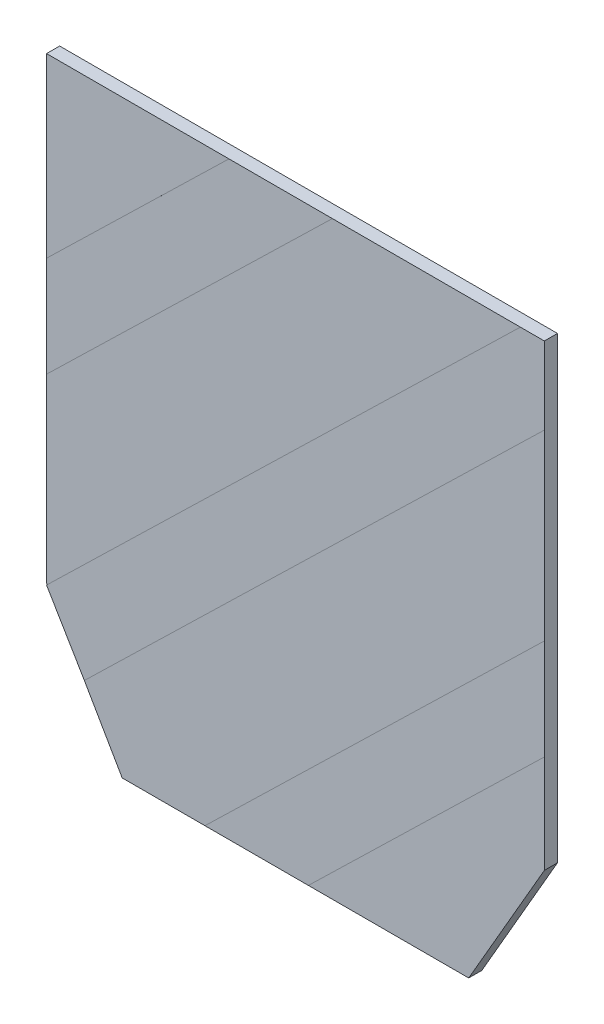
ISO-10303-21;
HEADER;
FILE_DESCRIPTION(('STEP AP214'),'2;1');
FILE_NAME('part.step','',(''),(''),'','','');
FILE_SCHEMA(('AUTOMOTIVE_DESIGN { 1 0 10303 214 1 1 1 1 }'));
ENDSEC;
DATA;
#1=APPLICATION_CONTEXT('core data for automotive mechanical design processes');
#2=APPLICATION_PROTOCOL_DEFINITION('international standard','automotive_design',2000,#1);
#3=PRODUCT_CONTEXT('',#1,'mechanical');
#4=PRODUCT('Part','Part','',(#3));
#5=PRODUCT_RELATED_PRODUCT_CATEGORY('part','',(#4));
#6=PRODUCT_DEFINITION_FORMATION('','',#4);
#7=PRODUCT_DEFINITION_CONTEXT('part definition',#1,'design');
#8=PRODUCT_DEFINITION('design','',#6,#7);
#9=PRODUCT_DEFINITION_SHAPE('','',#8);
#10=(LENGTH_UNIT() NAMED_UNIT(*) SI_UNIT(.MILLI.,.METRE.));
#11=(NAMED_UNIT(*) PLANE_ANGLE_UNIT() SI_UNIT($,.RADIAN.));
#12=(NAMED_UNIT(*) SI_UNIT($,.STERADIAN.) SOLID_ANGLE_UNIT());
#13=UNCERTAINTY_MEASURE_WITH_UNIT(LENGTH_MEASURE(1.E-05),#10,'distance_accuracy_value','');
#14=(GEOMETRIC_REPRESENTATION_CONTEXT(3) GLOBAL_UNCERTAINTY_ASSIGNED_CONTEXT((#13)) GLOBAL_UNIT_ASSIGNED_CONTEXT((#10,
#11,#12)) REPRESENTATION_CONTEXT('',''));
#15=CARTESIAN_POINT('',(0.,0.,0.));
#16=DIRECTION('',(0.,0.,1.));
#17=DIRECTION('',(1.,0.,0.));
#18=AXIS2_PLACEMENT_3D('',#15,#16,#17);
#19=CARTESIAN_POINT('',(0.,0.,2.));
#20=DIRECTION('',(0.,0.,-1.));
#21=DIRECTION('',(-1.,0.,0.));
#22=AXIS2_PLACEMENT_3D('',#19,#20,#21);
#23=PLANE('',#22);
#24=DIRECTION('',(0.717287947352775,0.696776865705544,0.));
#25=VECTOR('',#24,1.);
#26=CARTESIAN_POINT('',(1.96970193330662,-55.,2.));
#27=LINE('',#26,#25);
#28=CARTESIAN_POINT('',(1.96970193330662,-55.,2.));
#29=VERTEX_POINT('',#28);
#30=CARTESIAN_POINT('',(38.,-20.,2.));
#31=VERTEX_POINT('',#30);
#32=EDGE_CURVE('E350',#29,#31,#27,.T.);
#33=ORIENTED_EDGE('',*,*,#32,.F.);
#34=DIRECTION('',(1.,0.,0.));
#35=VECTOR('',#34,1.);
#36=CARTESIAN_POINT('',(-26.4529946162075,-55.,2.));
#37=LINE('',#36,#35);
#38=CARTESIAN_POINT('',(26.4529946162075,-55.,2.));
#39=VERTEX_POINT('',#38);
#40=EDGE_CURVE('E190',#29,#39,#37,.T.);
#41=ORIENTED_EDGE('',*,*,#40,.T.);
#42=DIRECTION('',(0.499999999999998,0.86602540378444,0.));
#43=VECTOR('',#42,1.);
#44=CARTESIAN_POINT('',(26.4529946162075,-55.,2.));
#45=LINE('',#44,#43);
#46=CARTESIAN_POINT('',(38.,-35.,2.));
#47=VERTEX_POINT('',#46);
#48=EDGE_CURVE('E303',#39,#47,#45,.T.);
#49=ORIENTED_EDGE('',*,*,#48,.T.);
#50=DIRECTION('',(0.,1.,0.));
#51=VECTOR('',#50,1.);
#52=CARTESIAN_POINT('',(38.,-35.,2.));
#53=LINE('',#52,#51);
#54=EDGE_CURVE('E62',#47,#31,#53,.T.);
#55=ORIENTED_EDGE('',*,*,#54,.T.);
#56=EDGE_LOOP('',(#33,#41,#49,#55));
#57=FACE_BOUND('',#56,.T.);
#58=ADVANCED_FACE('F36',(#57),#23,.F.);
#59=DIRECTION('',(-0.717287947352775,-0.696776865705544,0.));
#60=VECTOR('',#59,1.);
#61=CARTESIAN_POINT('',(-13.8172745600383,-55.,2.));
#62=LINE('',#61,#60);
#63=CARTESIAN_POINT('',(38.,-4.66445722307668,2.));
#64=VERTEX_POINT('',#63);
#65=CARTESIAN_POINT('',(-13.8172745600383,-55.,2.));
#66=VERTEX_POINT('',#65);
#67=EDGE_CURVE('E54',#64,#66,#62,.T.);
#68=ORIENTED_EDGE('',*,*,#67,.F.);
#69=CARTESIAN_POINT('',(38.,23.2183478258748,2.));
#70=VERTEX_POINT('',#69);
#71=EDGE_CURVE('E288',#64,#70,#53,.T.);
#72=ORIENTED_EDGE('',*,*,#71,.T.);
#73=DIRECTION('',(0.717287947352775,0.696776865705544,0.));
#74=VECTOR('',#73,1.);
#75=CARTESIAN_POINT('',(-32.2264973081038,-45.,2.));
#76=LINE('',#75,#74);
#77=CARTESIAN_POINT('',(-32.2264973081038,-45.,2.));
#78=VERTEX_POINT('',#77);
#79=EDGE_CURVE('E194',#78,#70,#76,.T.);
#80=ORIENTED_EDGE('',*,*,#79,.F.);
#81=DIRECTION('',(0.499999999999998,-0.86602540378444,0.));
#82=VECTOR('',#81,1.);
#83=CARTESIAN_POINT('',(-38.,-35.,2.));
#84=LINE('',#83,#82);
#85=CARTESIAN_POINT('',(-26.4529946162075,-55.,2.));
#86=VERTEX_POINT('',#85);
#87=EDGE_CURVE('E300',#78,#86,#84,.T.);
#88=ORIENTED_EDGE('',*,*,#87,.T.);
#89=EDGE_CURVE('E301',#86,#66,#37,.T.);
#90=ORIENTED_EDGE('',*,*,#89,.T.);
#91=EDGE_LOOP('',(#68,#72,#80,#88,#90));
#92=FACE_BOUND('',#91,.T.);
#93=ADVANCED_FACE('F344',(#92),#23,.F.);
#94=DIRECTION('',(-0.717287947352775,-0.696776865705545,0.));
#95=VECTOR('',#94,1.);
#96=CARTESIAN_POINT('',(-38.,-35.272864731733,2.));
#97=LINE('',#96,#95);
#98=CARTESIAN_POINT('',(34.3414932081361,35.,2.));
#99=VERTEX_POINT('',#98);
#100=CARTESIAN_POINT('',(-37.8990681616744,-35.1748190720813,2.));
#101=VERTEX_POINT('',#100);
#102=EDGE_CURVE('E204',#99,#101,#97,.T.);
#103=ORIENTED_EDGE('',*,*,#102,.F.);
#104=DIRECTION('',(-1.,0.,0.));
#105=VECTOR('',#104,1.);
#106=CARTESIAN_POINT('',(-38.,35.,2.));
#107=LINE('',#106,#105);
#108=CARTESIAN_POINT('',(5.63789958387258,35.,2.));
#109=VERTEX_POINT('',#108);
#110=EDGE_CURVE('E40',#99,#109,#107,.T.);
#111=ORIENTED_EDGE('',*,*,#110,.T.);
#112=DIRECTION('',(0.717287947352775,0.696776865705544,0.));
#113=VECTOR('',#112,1.);
#114=CARTESIAN_POINT('',(-38.,-7.39005968278155,2.));
#115=LINE('',#114,#113);
#116=CARTESIAN_POINT('',(-38.,-7.39005968278154,2.));
#117=VERTEX_POINT('',#116);
#118=EDGE_CURVE('E230',#117,#109,#115,.T.);
#119=ORIENTED_EDGE('',*,*,#118,.F.);
#120=DIRECTION('',(0.,-1.,0.));
#121=VECTOR('',#120,1.);
#122=CARTESIAN_POINT('',(-38.,-35.,2.));
#123=LINE('',#122,#121);
#124=CARTESIAN_POINT('',(-38.,-35.,2.));
#125=VERTEX_POINT('',#124);
#126=EDGE_CURVE('E250',#117,#125,#123,.T.);
#127=ORIENTED_EDGE('',*,*,#126,.T.);
#128=EDGE_CURVE('E295',#125,#101,#84,.T.);
#129=ORIENTED_EDGE('',*,*,#128,.T.);
#130=EDGE_LOOP('',(#103,#111,#119,#127,#129));
#131=FACE_BOUND('',#130,.T.);
#132=ADVANCED_FACE('F373',(#131),#23,.F.);
#133=DIRECTION('',(-0.717287947352775,-0.696776865705544,0.));
#134=VECTOR('',#133,1.);
#135=CARTESIAN_POINT('',(-38.,7.94548309414176,2.));
#136=LINE('',#135,#134);
#137=CARTESIAN_POINT('',(-10.1490769094724,35.,2.));
#138=VERTEX_POINT('',#137);
#139=CARTESIAN_POINT('',(-38.,7.94548309414177,2.));
#140=VERTEX_POINT('',#139);
#141=EDGE_CURVE('E235',#138,#140,#136,.T.);
#142=ORIENTED_EDGE('',*,*,#141,.F.);
#143=CARTESIAN_POINT('',(-38.,35.,2.));
#144=VERTEX_POINT('',#143);
#145=EDGE_CURVE('E283',#138,#144,#107,.T.);
#146=ORIENTED_EDGE('',*,*,#145,.T.);
#147=EDGE_CURVE('E290',#144,#140,#123,.T.);
#148=ORIENTED_EDGE('',*,*,#147,.T.);
#149=EDGE_LOOP('',(#142,#146,#148));
#150=FACE_BOUND('',#149,.T.);
#151=ADVANCED_FACE('F392',(#150),#23,.F.);
#152=CARTESIAN_POINT('',(38.,-35.,2.));
#153=DIRECTION('',(-1.,0.,0.));
#154=DIRECTION('',(0.,0.,1.));
#155=AXIS2_PLACEMENT_3D('',#152,#153,#154);
#156=PLANE('',#155);
#157=DIRECTION('',(0.,1.,0.));
#158=VECTOR('',#157,1.);
#159=CARTESIAN_POINT('',(38.,-35.,0.));
#160=LINE('',#159,#158);
#161=CARTESIAN_POINT('',(38.,-35.,0.));
#162=VERTEX_POINT('',#161);
#163=CARTESIAN_POINT('',(38.,35.,0.));
#164=VERTEX_POINT('',#163);
#165=EDGE_CURVE('E262',#162,#164,#160,.T.);
#166=ORIENTED_EDGE('',*,*,#165,.T.);
#167=DIRECTION('',(0.,0.,-1.));
#168=VECTOR('',#167,1.);
#169=CARTESIAN_POINT('',(38.,35.,2.));
#170=LINE('',#169,#168);
#171=CARTESIAN_POINT('',(38.,35.,2.0001));
#172=VERTEX_POINT('',#171);
#173=EDGE_CURVE('E11',#172,#164,#170,.T.);
#174=ORIENTED_EDGE('',*,*,#173,.F.);
#175=DIRECTION('',(0.,1.,0.));
#176=VECTOR('',#175,1.);
#177=CARTESIAN_POINT('',(38.,35.,2.0001));
#178=LINE('',#177,#176);
#179=CARTESIAN_POINT('',(38.,23.2183478258748,2.0001));
#180=VERTEX_POINT('',#179);
#181=EDGE_CURVE('E206',#180,#172,#178,.T.);
#182=ORIENTED_EDGE('',*,*,#181,.F.);
#183=DIRECTION('',(0.,0.,-1.));
#184=VECTOR('',#183,1.);
#185=CARTESIAN_POINT('',(38.,23.2183478258748,2.0001));
#186=LINE('',#185,#184);
#187=EDGE_CURVE('E224',#180,#70,#186,.T.);
#188=ORIENTED_EDGE('',*,*,#187,.T.);
#189=ORIENTED_EDGE('',*,*,#71,.F.);
#190=DIRECTION('',(0.,0.,-1.));
#191=VECTOR('',#190,1.);
#192=CARTESIAN_POINT('',(38.,-4.66445722307668,2.0001));
#193=LINE('',#192,#191);
#194=CARTESIAN_POINT('',(38.,-4.66445722307668,2.0001));
#195=VERTEX_POINT('',#194);
#196=EDGE_CURVE('E196',#195,#64,#193,.T.);
#197=ORIENTED_EDGE('',*,*,#196,.F.);
#198=DIRECTION('',(0.,1.,0.));
#199=VECTOR('',#198,1.);
#200=CARTESIAN_POINT('',(38.,-4.66445722307668,2.0001));
#201=LINE('',#200,#199);
#202=CARTESIAN_POINT('',(38.,-20.,2.0001));
#203=VERTEX_POINT('',#202);
#204=EDGE_CURVE('E177',#203,#195,#201,.T.);
#205=ORIENTED_EDGE('',*,*,#204,.F.);
#206=DIRECTION('',(0.,0.,-1.));
#207=VECTOR('',#206,1.);
#208=CARTESIAN_POINT('',(38.,-20.,2.0001));
#209=LINE('',#208,#207);
#210=EDGE_CURVE('E174',#203,#31,#209,.T.);
#211=ORIENTED_EDGE('',*,*,#210,.T.);
#212=ORIENTED_EDGE('',*,*,#54,.F.);
#213=DIRECTION('',(0.,0.,-1.));
#214=VECTOR('',#213,1.);
#215=CARTESIAN_POINT('',(38.,-35.,2.));
#216=LINE('',#215,#214);
#217=EDGE_CURVE('E305',#47,#162,#216,.T.);
#218=ORIENTED_EDGE('',*,*,#217,.T.);
#219=EDGE_LOOP('',(#166,#174,#182,#188,#189,#197,#205,#211,#212,#218));
#220=FACE_BOUND('',#219,.T.);
#221=ADVANCED_FACE('F38',(#220),#156,.F.);
#222=CARTESIAN_POINT('',(-38.,35.,2.));
#223=DIRECTION('',(0.,-1.,0.));
#224=DIRECTION('',(0.,0.,-1.));
#225=AXIS2_PLACEMENT_3D('',#222,#223,#224);
#226=PLANE('',#225);
#227=DIRECTION('',(-1.,0.,0.));
#228=VECTOR('',#227,1.);
#229=CARTESIAN_POINT('',(-38.,35.,0.));
#230=LINE('',#229,#228);
#231=CARTESIAN_POINT('',(-38.,35.,0.));
#232=VERTEX_POINT('',#231);
#233=EDGE_CURVE('E308',#164,#232,#230,.T.);
#234=ORIENTED_EDGE('',*,*,#233,.T.);
#235=DIRECTION('',(0.,0.,-1.));
#236=VECTOR('',#235,1.);
#237=CARTESIAN_POINT('',(-38.,35.,2.));
#238=LINE('',#237,#236);
#239=EDGE_CURVE('E46',#144,#232,#238,.T.);
#240=ORIENTED_EDGE('',*,*,#239,.F.);
#241=ORIENTED_EDGE('',*,*,#145,.F.);
#242=DIRECTION('',(0.,0.,-1.));
#243=VECTOR('',#242,1.);
#244=CARTESIAN_POINT('',(-10.1490769094724,35.,2.0001));
#245=LINE('',#244,#243);
#246=CARTESIAN_POINT('',(-10.1490769094724,35.,2.0001));
#247=VERTEX_POINT('',#246);
#248=EDGE_CURVE('E257',#247,#138,#245,.T.);
#249=ORIENTED_EDGE('',*,*,#248,.F.);
#250=DIRECTION('',(-1.,0.,0.));
#251=VECTOR('',#250,1.);
#252=CARTESIAN_POINT('',(-10.1490769094724,35.,2.0001));
#253=LINE('',#252,#251);
#254=CARTESIAN_POINT('',(5.63789958387258,35.,2.0001));
#255=VERTEX_POINT('',#254);
#256=EDGE_CURVE('E237',#255,#247,#253,.T.);
#257=ORIENTED_EDGE('',*,*,#256,.F.);
#258=DIRECTION('',(0.,0.,-1.));
#259=VECTOR('',#258,1.);
#260=CARTESIAN_POINT('',(5.63789958387258,35.,2.0001));
#261=LINE('',#260,#259);
#262=EDGE_CURVE('E253',#255,#109,#261,.T.);
#263=ORIENTED_EDGE('',*,*,#262,.T.);
#264=ORIENTED_EDGE('',*,*,#110,.F.);
#265=DIRECTION('',(0.,0.,-1.));
#266=VECTOR('',#265,1.);
#267=CARTESIAN_POINT('',(34.3414932081361,35.,2.0001));
#268=LINE('',#267,#266);
#269=CARTESIAN_POINT('',(34.3414932081361,35.,2.0001));
#270=VERTEX_POINT('',#269);
#271=EDGE_CURVE('E221',#270,#99,#268,.T.);
#272=ORIENTED_EDGE('',*,*,#271,.F.);
#273=DIRECTION('',(-1.,0.,0.));
#274=VECTOR('',#273,1.);
#275=CARTESIAN_POINT('',(34.3414932081361,35.,2.0001));
#276=LINE('',#275,#274);
#277=EDGE_CURVE('E209',#172,#270,#276,.T.);
#278=ORIENTED_EDGE('',*,*,#277,.F.);
#279=ORIENTED_EDGE('',*,*,#173,.T.);
#280=EDGE_LOOP('',(#234,#240,#241,#249,#257,#263,#264,#272,#278,#279));
#281=FACE_BOUND('',#280,.T.);
#282=ADVANCED_FACE('F281',(#281),#226,.F.);
#283=CARTESIAN_POINT('',(-38.,-35.,2.));
#284=DIRECTION('',(1.,0.,0.));
#285=DIRECTION('',(0.,0.,-1.));
#286=AXIS2_PLACEMENT_3D('',#283,#284,#285);
#287=PLANE('',#286);
#288=DIRECTION('',(0.,-1.,0.));
#289=VECTOR('',#288,1.);
#290=CARTESIAN_POINT('',(-38.,-35.,0.));
#291=LINE('',#290,#289);
#292=CARTESIAN_POINT('',(-38.,-35.,0.));
#293=VERTEX_POINT('',#292);
#294=EDGE_CURVE('E310',#232,#293,#291,.T.);
#295=ORIENTED_EDGE('',*,*,#294,.T.);
#296=DIRECTION('',(0.,0.,-1.));
#297=VECTOR('',#296,1.);
#298=CARTESIAN_POINT('',(-38.,-35.,2.));
#299=LINE('',#298,#297);
#300=EDGE_CURVE('E326',#125,#293,#299,.T.);
#301=ORIENTED_EDGE('',*,*,#300,.F.);
#302=ORIENTED_EDGE('',*,*,#126,.F.);
#303=DIRECTION('',(0.,0.,-1.));
#304=VECTOR('',#303,1.);
#305=CARTESIAN_POINT('',(-38.,-7.39005968278155,2.0001));
#306=LINE('',#305,#304);
#307=CARTESIAN_POINT('',(-38.,-7.39005968278155,2.0001));
#308=VERTEX_POINT('',#307);
#309=EDGE_CURVE('E256',#308,#117,#306,.T.);
#310=ORIENTED_EDGE('',*,*,#309,.F.);
#311=DIRECTION('',(0.,-1.,0.));
#312=VECTOR('',#311,1.);
#313=CARTESIAN_POINT('',(-38.,7.94548309414176,2.0001));
#314=LINE('',#313,#312);
#315=CARTESIAN_POINT('',(-38.,7.94548309414176,2.0001));
#316=VERTEX_POINT('',#315);
#317=EDGE_CURVE('E231',#316,#308,#314,.T.);
#318=ORIENTED_EDGE('',*,*,#317,.F.);
#319=DIRECTION('',(0.,0.,-1.));
#320=VECTOR('',#319,1.);
#321=CARTESIAN_POINT('',(-38.,7.94548309414176,2.0001));
#322=LINE('',#321,#320);
#323=EDGE_CURVE('E241',#316,#140,#322,.T.);
#324=ORIENTED_EDGE('',*,*,#323,.T.);
#325=ORIENTED_EDGE('',*,*,#147,.F.);
#326=ORIENTED_EDGE('',*,*,#239,.T.);
#327=EDGE_LOOP('',(#295,#301,#302,#310,#318,#324,#325,#326));
#328=FACE_BOUND('',#327,.T.);
#329=ADVANCED_FACE('F330',(#328),#287,.F.);
#330=CARTESIAN_POINT('',(-38.,-35.,2.));
#331=DIRECTION('',(0.86602540378444,0.499999999999998,0.));
#332=DIRECTION('',(-0.499999999999998,0.86602540378444,0.));
#333=AXIS2_PLACEMENT_3D('',#330,#331,#332);
#334=PLANE('',#333);
#335=DIRECTION('',(0.499999999999998,-0.86602540378444,0.));
#336=VECTOR('',#335,1.);
#337=CARTESIAN_POINT('',(-38.,-35.,0.));
#338=LINE('',#337,#336);
#339=CARTESIAN_POINT('',(-26.4529946162075,-55.,0.));
#340=VERTEX_POINT('',#339);
#341=EDGE_CURVE('E312',#293,#340,#338,.T.);
#342=ORIENTED_EDGE('',*,*,#341,.T.);
#343=DIRECTION('',(0.,0.,-1.));
#344=VECTOR('',#343,1.);
#345=CARTESIAN_POINT('',(-26.4529946162075,-55.,2.));
#346=LINE('',#345,#344);
#347=EDGE_CURVE('E323',#86,#340,#346,.T.);
#348=ORIENTED_EDGE('',*,*,#347,.F.);
#349=ORIENTED_EDGE('',*,*,#87,.F.);
#350=EDGE_CURVE('E299',#101,#78,#84,.T.);
#351=ORIENTED_EDGE('',*,*,#350,.F.);
#352=ORIENTED_EDGE('',*,*,#128,.F.);
#353=ORIENTED_EDGE('',*,*,#300,.T.);
#354=EDGE_LOOP('',(#342,#348,#349,#351,#352,#353));
#355=FACE_BOUND('',#354,.T.);
#356=ADVANCED_FACE('F340',(#355),#334,.F.);
#357=CARTESIAN_POINT('',(-26.4529946162075,-55.,2.));
#358=DIRECTION('',(0.,1.,0.));
#359=DIRECTION('',(0.,0.,1.));
#360=AXIS2_PLACEMENT_3D('',#357,#358,#359);
#361=PLANE('',#360);
#362=DIRECTION('',(1.,0.,0.));
#363=VECTOR('',#362,1.);
#364=CARTESIAN_POINT('',(-26.4529946162075,-55.,0.));
#365=LINE('',#364,#363);
#366=CARTESIAN_POINT('',(26.4529946162075,-55.,0.));
#367=VERTEX_POINT('',#366);
#368=EDGE_CURVE('E314',#340,#367,#365,.T.);
#369=ORIENTED_EDGE('',*,*,#368,.T.);
#370=DIRECTION('',(0.,0.,-1.));
#371=VECTOR('',#370,1.);
#372=CARTESIAN_POINT('',(26.4529946162075,-55.,2.));
#373=LINE('',#372,#371);
#374=EDGE_CURVE('E320',#39,#367,#373,.T.);
#375=ORIENTED_EDGE('',*,*,#374,.F.);
#376=ORIENTED_EDGE('',*,*,#40,.F.);
#377=DIRECTION('',(0.,0.,-1.));
#378=VECTOR('',#377,1.);
#379=CARTESIAN_POINT('',(1.96970193330662,-55.,2.0001));
#380=LINE('',#379,#378);
#381=CARTESIAN_POINT('',(1.96970193330662,-55.,2.0001));
#382=VERTEX_POINT('',#381);
#383=EDGE_CURVE('E172',#382,#29,#380,.T.);
#384=ORIENTED_EDGE('',*,*,#383,.F.);
#385=DIRECTION('',(1.,0.,0.));
#386=VECTOR('',#385,1.);
#387=CARTESIAN_POINT('',(-13.8172745600383,-55.,2.0001));
#388=LINE('',#387,#386);
#389=CARTESIAN_POINT('',(-13.8172745600383,-55.,2.0001));
#390=VERTEX_POINT('',#389);
#391=EDGE_CURVE('E178',#390,#382,#388,.T.);
#392=ORIENTED_EDGE('',*,*,#391,.F.);
#393=DIRECTION('',(0.,0.,-1.));
#394=VECTOR('',#393,1.);
#395=CARTESIAN_POINT('',(-13.8172745600383,-55.,2.0001));
#396=LINE('',#395,#394);
#397=EDGE_CURVE('E343',#390,#66,#396,.T.);
#398=ORIENTED_EDGE('',*,*,#397,.T.);
#399=ORIENTED_EDGE('',*,*,#89,.F.);
#400=ORIENTED_EDGE('',*,*,#347,.T.);
#401=EDGE_LOOP('',(#369,#375,#376,#384,#392,#398,#399,#400));
#402=FACE_BOUND('',#401,.T.);
#403=ADVANCED_FACE('F188',(#402),#361,.F.);
#404=CARTESIAN_POINT('',(26.4529946162075,-55.,2.));
#405=DIRECTION('',(-0.86602540378444,0.499999999999998,0.));
#406=DIRECTION('',(-0.499999999999998,-0.86602540378444,0.));
#407=AXIS2_PLACEMENT_3D('',#404,#405,#406);
#408=PLANE('',#407);
#409=DIRECTION('',(0.499999999999998,0.86602540378444,0.));
#410=VECTOR('',#409,1.);
#411=CARTESIAN_POINT('',(26.4529946162075,-55.,0.));
#412=LINE('',#411,#410);
#413=EDGE_CURVE('E316',#367,#162,#412,.T.);
#414=ORIENTED_EDGE('',*,*,#413,.T.);
#415=ORIENTED_EDGE('',*,*,#217,.F.);
#416=ORIENTED_EDGE('',*,*,#48,.F.);
#417=ORIENTED_EDGE('',*,*,#374,.T.);
#418=EDGE_LOOP('',(#414,#415,#416,#417));
#419=FACE_BOUND('',#418,.T.);
#420=ADVANCED_FACE('F423',(#419),#408,.F.);
#421=CARTESIAN_POINT('',(0.,0.,0.));
#422=DIRECTION('',(0.,0.,-1.));
#423=DIRECTION('',(-1.,0.,0.));
#424=AXIS2_PLACEMENT_3D('',#421,#422,#423);
#425=PLANE('',#424);
#426=ORIENTED_EDGE('',*,*,#165,.F.);
#427=ORIENTED_EDGE('',*,*,#413,.F.);
#428=ORIENTED_EDGE('',*,*,#368,.F.);
#429=ORIENTED_EDGE('',*,*,#341,.F.);
#430=ORIENTED_EDGE('',*,*,#294,.F.);
#431=ORIENTED_EDGE('',*,*,#233,.F.);
#432=EDGE_LOOP('',(#426,#427,#428,#429,#430,#431));
#433=FACE_BOUND('',#432,.T.);
#434=ADVANCED_FACE('F335',(#433),#425,.T.);
#435=CARTESIAN_POINT('',(-38.,-7.39005968278155,2.0001));
#436=DIRECTION('',(-0.696776865705544,0.717287947352775,0.));
#437=DIRECTION('',(-0.717287947352775,-0.696776865705544,0.));
#438=AXIS2_PLACEMENT_3D('',#435,#436,#437);
#439=PLANE('',#438);
#440=ORIENTED_EDGE('',*,*,#118,.T.);
#441=ORIENTED_EDGE('',*,*,#262,.F.);
#442=DIRECTION('',(0.717287947352775,0.696776865705544,0.));
#443=VECTOR('',#442,1.);
#444=CARTESIAN_POINT('',(-38.,-7.39005968278155,2.0001));
#445=LINE('',#444,#443);
#446=EDGE_CURVE('E234',#308,#255,#445,.T.);
#447=ORIENTED_EDGE('',*,*,#446,.F.);
#448=ORIENTED_EDGE('',*,*,#309,.T.);
#449=EDGE_LOOP('',(#440,#441,#447,#448));
#450=FACE_BOUND('',#449,.T.);
#451=ADVANCED_FACE('F377',(#450),#439,.F.);
#452=CARTESIAN_POINT('',(-38.,7.94548309414176,2.0001));
#453=DIRECTION('',(0.696776865705544,-0.717287947352775,0.));
#454=DIRECTION('',(0.717287947352775,0.696776865705544,0.));
#455=AXIS2_PLACEMENT_3D('',#452,#453,#454);
#456=PLANE('',#455);
#457=ORIENTED_EDGE('',*,*,#141,.T.);
#458=ORIENTED_EDGE('',*,*,#323,.F.);
#459=DIRECTION('',(-0.717287947352775,-0.696776865705544,0.));
#460=VECTOR('',#459,1.);
#461=CARTESIAN_POINT('',(-38.,7.94548309414176,2.0001));
#462=LINE('',#461,#460);
#463=EDGE_CURVE('E239',#247,#316,#462,.T.);
#464=ORIENTED_EDGE('',*,*,#463,.F.);
#465=ORIENTED_EDGE('',*,*,#248,.T.);
#466=EDGE_LOOP('',(#457,#458,#464,#465));
#467=FACE_BOUND('',#466,.T.);
#468=ADVANCED_FACE('F276',(#467),#456,.F.);
#469=CARTESIAN_POINT('',(0.,0.,2.0001));
#470=DIRECTION('',(0.,0.,1.));
#471=DIRECTION('',(1.,0.,0.));
#472=AXIS2_PLACEMENT_3D('',#469,#470,#471);
#473=PLANE('',#472);
#474=ORIENTED_EDGE('',*,*,#317,.T.);
#475=ORIENTED_EDGE('',*,*,#446,.T.);
#476=ORIENTED_EDGE('',*,*,#256,.T.);
#477=ORIENTED_EDGE('',*,*,#463,.T.);
#478=EDGE_LOOP('',(#474,#475,#476,#477));
#479=FACE_BOUND('',#478,.T.);
#480=ADVANCED_FACE('F380',(#479),#473,.T.);
#481=CARTESIAN_POINT('',(0.,0.,2.));
#482=DIRECTION('',(0.,0.,1.));
#483=DIRECTION('',(1.,0.,0.));
#484=AXIS2_PLACEMENT_3D('',#481,#482,#483);
#485=PLANE('',#484);
#486=CARTESIAN_POINT('',(-38.,-35.272864731733,2.));
#487=VERTEX_POINT('',#486);
#488=EDGE_CURVE('E216',#101,#487,#97,.T.);
#489=ORIENTED_EDGE('',*,*,#488,.F.);
#490=ORIENTED_EDGE('',*,*,#350,.T.);
#491=DIRECTION('',(0.510409077246612,-0.859931726280792,0.));
#492=VECTOR('',#491,1.);
#493=CARTESIAN_POINT('',(-38.,-35.272864731733,2.));
#494=LINE('',#493,#492);
#495=EDGE_CURVE('E191',#487,#78,#494,.T.);
#496=ORIENTED_EDGE('',*,*,#495,.F.);
#497=EDGE_LOOP('',(#489,#490,#496));
#498=FACE_BOUND('',#497,.T.);
#499=ADVANCED_FACE('F370',(#498),#485,.F.);
#500=CARTESIAN_POINT('',(-38.,-35.272864731733,2.0001));
#501=DIRECTION('',(0.859931726280792,0.510409077246612,0.));
#502=DIRECTION('',(-0.510409077246612,0.859931726280792,0.));
#503=AXIS2_PLACEMENT_3D('',#500,#501,#502);
#504=PLANE('',#503);
#505=ORIENTED_EDGE('',*,*,#495,.T.);
#506=DIRECTION('',(0.,0.,-1.));
#507=VECTOR('',#506,1.);
#508=CARTESIAN_POINT('',(-32.2264973081038,-45.,2.0001));
#509=LINE('',#508,#507);
#510=CARTESIAN_POINT('',(-32.2264973081038,-45.,2.0001));
#511=VERTEX_POINT('',#510);
#512=EDGE_CURVE('E227',#511,#78,#509,.T.);
#513=ORIENTED_EDGE('',*,*,#512,.F.);
#514=DIRECTION('',(0.510409077246612,-0.859931726280792,0.));
#515=VECTOR('',#514,1.);
#516=CARTESIAN_POINT('',(-38.,-35.272864731733,2.0001));
#517=LINE('',#516,#515);
#518=CARTESIAN_POINT('',(-38.,-35.272864731733,2.0001));
#519=VERTEX_POINT('',#518);
#520=EDGE_CURVE('E200',#519,#511,#517,.T.);
#521=ORIENTED_EDGE('',*,*,#520,.F.);
#522=DIRECTION('',(0.,0.,-1.));
#523=VECTOR('',#522,1.);
#524=CARTESIAN_POINT('',(-38.,-35.272864731733,2.0001));
#525=LINE('',#524,#523);
#526=EDGE_CURVE('E212',#519,#487,#525,.T.);
#527=ORIENTED_EDGE('',*,*,#526,.T.);
#528=EDGE_LOOP('',(#505,#513,#521,#527));
#529=FACE_BOUND('',#528,.T.);
#530=ADVANCED_FACE('F366',(#529),#504,.F.);
#531=CARTESIAN_POINT('',(-32.2264973081038,-45.,2.0001));
#532=DIRECTION('',(-0.696776865705544,0.717287947352775,0.));
#533=DIRECTION('',(-0.717287947352775,-0.696776865705544,0.));
#534=AXIS2_PLACEMENT_3D('',#531,#532,#533);
#535=PLANE('',#534);
#536=ORIENTED_EDGE('',*,*,#79,.T.);
#537=ORIENTED_EDGE('',*,*,#187,.F.);
#538=DIRECTION('',(0.717287947352775,0.696776865705544,0.));
#539=VECTOR('',#538,1.);
#540=CARTESIAN_POINT('',(-32.2264973081038,-45.,2.0001));
#541=LINE('',#540,#539);
#542=EDGE_CURVE('E203',#511,#180,#541,.T.);
#543=ORIENTED_EDGE('',*,*,#542,.F.);
#544=ORIENTED_EDGE('',*,*,#512,.T.);
#545=EDGE_LOOP('',(#536,#537,#543,#544));
#546=FACE_BOUND('',#545,.T.);
#547=ADVANCED_FACE('F361',(#546),#535,.F.);
#548=CARTESIAN_POINT('',(-38.,-35.272864731733,2.0001));
#549=DIRECTION('',(0.696776865705544,-0.717287947352775,0.));
#550=DIRECTION('',(0.717287947352775,0.696776865705544,0.));
#551=AXIS2_PLACEMENT_3D('',#548,#549,#550);
#552=PLANE('',#551);
#553=ORIENTED_EDGE('',*,*,#102,.T.);
#554=ORIENTED_EDGE('',*,*,#488,.T.);
#555=ORIENTED_EDGE('',*,*,#526,.F.);
#556=DIRECTION('',(-0.717287947352775,-0.696776865705545,0.));
#557=VECTOR('',#556,1.);
#558=CARTESIAN_POINT('',(-38.,-35.272864731733,2.0001));
#559=LINE('',#558,#557);
#560=EDGE_CURVE('E211',#270,#519,#559,.T.);
#561=ORIENTED_EDGE('',*,*,#560,.F.);
#562=ORIENTED_EDGE('',*,*,#271,.T.);
#563=EDGE_LOOP('',(#553,#554,#555,#561,#562));
#564=FACE_BOUND('',#563,.T.);
#565=ADVANCED_FACE('F524',(#564),#552,.F.);
#566=CARTESIAN_POINT('',(0.,0.,2.0001));
#567=DIRECTION('',(0.,0.,1.));
#568=DIRECTION('',(1.,0.,0.));
#569=AXIS2_PLACEMENT_3D('',#566,#567,#568);
#570=PLANE('',#569);
#571=ORIENTED_EDGE('',*,*,#520,.T.);
#572=ORIENTED_EDGE('',*,*,#542,.T.);
#573=ORIENTED_EDGE('',*,*,#181,.T.);
#574=ORIENTED_EDGE('',*,*,#277,.T.);
#575=ORIENTED_EDGE('',*,*,#560,.T.);
#576=EDGE_LOOP('',(#571,#572,#573,#574,#575));
#577=FACE_BOUND('',#576,.T.);
#578=ADVANCED_FACE('F532',(#577),#570,.T.);
#579=CARTESIAN_POINT('',(1.96970193330662,-55.,2.0001));
#580=DIRECTION('',(-0.696776865705544,0.717287947352775,0.));
#581=DIRECTION('',(-0.717287947352775,-0.696776865705544,0.));
#582=AXIS2_PLACEMENT_3D('',#579,#580,#581);
#583=PLANE('',#582);
#584=ORIENTED_EDGE('',*,*,#32,.T.);
#585=ORIENTED_EDGE('',*,*,#210,.F.);
#586=DIRECTION('',(0.717287947352775,0.696776865705544,0.));
#587=VECTOR('',#586,1.);
#588=CARTESIAN_POINT('',(1.96970193330662,-55.,2.0001));
#589=LINE('',#588,#587);
#590=EDGE_CURVE('E168',#382,#203,#589,.T.);
#591=ORIENTED_EDGE('',*,*,#590,.F.);
#592=ORIENTED_EDGE('',*,*,#383,.T.);
#593=EDGE_LOOP('',(#584,#585,#591,#592));
#594=FACE_BOUND('',#593,.T.);
#595=ADVANCED_FACE('F170',(#594),#583,.F.);
#596=CARTESIAN_POINT('',(-13.8172745600383,-55.,2.0001));
#597=DIRECTION('',(0.696776865705544,-0.717287947352775,0.));
#598=DIRECTION('',(0.717287947352775,0.696776865705544,0.));
#599=AXIS2_PLACEMENT_3D('',#596,#597,#598);
#600=PLANE('',#599);
#601=ORIENTED_EDGE('',*,*,#67,.T.);
#602=ORIENTED_EDGE('',*,*,#397,.F.);
#603=DIRECTION('',(-0.717287947352775,-0.696776865705544,0.));
#604=VECTOR('',#603,1.);
#605=CARTESIAN_POINT('',(-13.8172745600383,-55.,2.0001));
#606=LINE('',#605,#604);
#607=EDGE_CURVE('E183',#195,#390,#606,.T.);
#608=ORIENTED_EDGE('',*,*,#607,.F.);
#609=ORIENTED_EDGE('',*,*,#196,.T.);
#610=EDGE_LOOP('',(#601,#602,#608,#609));
#611=FACE_BOUND('',#610,.T.);
#612=ADVANCED_FACE('F348',(#611),#600,.F.);
#613=CARTESIAN_POINT('',(0.,0.,2.0001));
#614=DIRECTION('',(0.,0.,-1.));
#615=DIRECTION('',(-1.,0.,0.));
#616=AXIS2_PLACEMENT_3D('',#613,#614,#615);
#617=PLANE('',#616);
#618=ORIENTED_EDGE('',*,*,#391,.T.);
#619=ORIENTED_EDGE('',*,*,#590,.T.);
#620=ORIENTED_EDGE('',*,*,#204,.T.);
#621=ORIENTED_EDGE('',*,*,#607,.T.);
#622=EDGE_LOOP('',(#618,#619,#620,#621));
#623=FACE_BOUND('',#622,.T.);
#624=ADVANCED_FACE('F181',(#623),#617,.F.);
#625=CLOSED_SHELL('',(#58,#93,#132,#151,#221,#282,#329,#356,#403,#420,#434,#451,#468,#480,#499,
#530,#547,#565,#578,#595,#612,#624));
#626=MANIFOLD_SOLID_BREP('B2',#625);
#627=ADVANCED_BREP_SHAPE_REPRESENTATION('',(#18,#626),#14);
#628=SHAPE_DEFINITION_REPRESENTATION(#9,#627);
ENDSEC;
END-ISO-10303-21;
